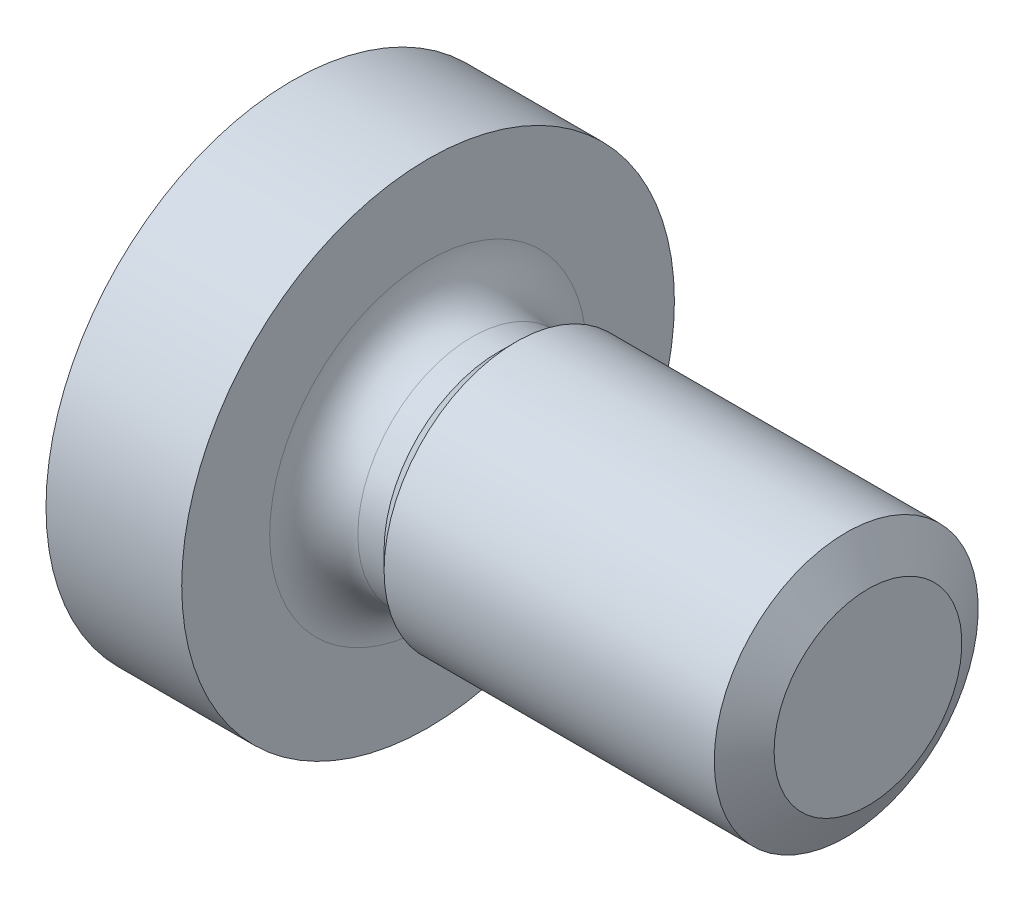
ISO-10303-21;
HEADER;
FILE_DESCRIPTION(('STEP AP214'),'2;1');
FILE_NAME('part.step','',(''),(''),'','','');
FILE_SCHEMA(('AUTOMOTIVE_DESIGN { 1 0 10303 214 1 1 1 1 }'));
ENDSEC;
DATA;
#1=APPLICATION_CONTEXT('core data for automotive mechanical design processes');
#2=APPLICATION_PROTOCOL_DEFINITION('international standard','automotive_design',2000,#1);
#3=PRODUCT_CONTEXT('',#1,'mechanical');
#4=PRODUCT('Part','Part','',(#3));
#5=PRODUCT_RELATED_PRODUCT_CATEGORY('part','',(#4));
#6=PRODUCT_DEFINITION_FORMATION('','',#4);
#7=PRODUCT_DEFINITION_CONTEXT('part definition',#1,'design');
#8=PRODUCT_DEFINITION('design','',#6,#7);
#9=PRODUCT_DEFINITION_SHAPE('','',#8);
#10=(LENGTH_UNIT() NAMED_UNIT(*) SI_UNIT(.MILLI.,.METRE.));
#11=(NAMED_UNIT(*) PLANE_ANGLE_UNIT() SI_UNIT($,.RADIAN.));
#12=(NAMED_UNIT(*) SI_UNIT($,.STERADIAN.) SOLID_ANGLE_UNIT());
#13=UNCERTAINTY_MEASURE_WITH_UNIT(LENGTH_MEASURE(1.E-05),#10,'distance_accuracy_value','');
#14=(GEOMETRIC_REPRESENTATION_CONTEXT(3) GLOBAL_UNCERTAINTY_ASSIGNED_CONTEXT((#13)) GLOBAL_UNIT_ASSIGNED_CONTEXT((#10,
#11,#12)) REPRESENTATION_CONTEXT('',''));
#15=CARTESIAN_POINT('',(0.,0.,0.));
#16=DIRECTION('',(0.,0.,1.));
#17=DIRECTION('',(1.,0.,0.));
#18=AXIS2_PLACEMENT_3D('',#15,#16,#17);
#19=CARTESIAN_POINT('',(1.8,0.,0.));
#20=DIRECTION('',(0.137568371274688,0.,-0.990492273177751));
#21=DIRECTION('',(-0.990492273177752,0.,-0.137568371274688));
#22=AXIS2_PLACEMENT_3D('',#19,#20,#21);
#23=PLANE('',#22);
#24=DIRECTION('',(-0.763885421064628,-0.636571184220523,-0.106095197370087));
#25=VECTOR('',#24,1.);
#26=CARTESIAN_POINT('',(1.8,0.,0.));
#27=LINE('',#26,#25);
#28=CARTESIAN_POINT('',(1.8,0.,0.));
#29=VERTEX_POINT('',#28);
#30=CARTESIAN_POINT('',(0.188839901093437,-1.34263341575547,-0.223772235959245));
#31=VERTEX_POINT('',#30);
#32=EDGE_CURVE('E159',#29,#31,#27,.T.);
#33=ORIENTED_EDGE('',*,*,#32,.F.);
#34=DIRECTION('',(-0.981250680241291,-0.136284816700179,-0.136284816700179));
#35=VECTOR('',#34,1.);
#36=CARTESIAN_POINT('',(1.8,0.,0.));
#37=LINE('',#36,#35);
#38=CARTESIAN_POINT('',(0.0123443765883179,-0.248285503251622,-0.248285503251623));
#39=VERTEX_POINT('',#38);
#40=EDGE_CURVE('E120',#29,#39,#37,.T.);
#41=ORIENTED_EDGE('',*,*,#40,.T.);
#42=CARTESIAN_POINT('',(4.93943981831946,0.,0.436033308099924));
#43=DIRECTION('',(0.137568371274688,0.,-0.990492273177751));
#44=DIRECTION('',(-0.990492273177752,0.,-0.137568371274688));
#45=AXIS2_PLACEMENT_3D('',#42,#43,#44);
#46=CIRCLE('',#45,4.98058304002877);
#47=EDGE_CURVE('E133',#31,#39,#46,.T.);
#48=ORIENTED_EDGE('',*,*,#47,.F.);
#49=EDGE_LOOP('',(#33,#41,#48));
#50=FACE_BOUND('',#49,.T.);
#51=ADVANCED_FACE('F40',(#50),#23,.F.);
#52=CARTESIAN_POINT('',(1.8,0.,0.));
#53=DIRECTION('',(0.137568371274688,0.,0.990492273177752));
#54=DIRECTION('',(0.990492273177752,0.,-0.137568371274688));
#55=AXIS2_PLACEMENT_3D('',#52,#53,#54);
#56=PLANE('',#55);
#57=CARTESIAN_POINT('',(4.93943981831946,0.,-0.436033308099924));
#58=DIRECTION('',(0.137568371274688,0.,0.990492273177752));
#59=DIRECTION('',(0.990492273177752,0.,-0.137568371274688));
#60=AXIS2_PLACEMENT_3D('',#57,#58,#59);
#61=CIRCLE('',#60,4.98058304002877);
#62=CARTESIAN_POINT('',(0.0123443765883179,-0.248285503251624,0.248285503251622));
#63=VERTEX_POINT('',#62);
#64=CARTESIAN_POINT('',(0.188839901093437,-1.34263341575547,0.223772235959245));
#65=VERTEX_POINT('',#64);
#66=EDGE_CURVE('E63',#63,#65,#61,.T.);
#67=ORIENTED_EDGE('',*,*,#66,.F.);
#68=DIRECTION('',(0.981250680241291,0.13628481670018,-0.136284816700179));
#69=VECTOR('',#68,1.);
#70=CARTESIAN_POINT('',(1.8,0.,0.));
#71=LINE('',#70,#69);
#72=EDGE_CURVE('E11',#63,#29,#71,.T.);
#73=ORIENTED_EDGE('',*,*,#72,.T.);
#74=DIRECTION('',(-0.763885421064628,-0.636571184220523,0.106095197370087));
#75=VECTOR('',#74,1.);
#76=CARTESIAN_POINT('',(1.8,0.,0.));
#77=LINE('',#76,#75);
#78=EDGE_CURVE('E160',#29,#65,#77,.T.);
#79=ORIENTED_EDGE('',*,*,#78,.T.);
#80=EDGE_LOOP('',(#67,#73,#79));
#81=FACE_BOUND('',#80,.T.);
#82=ADVANCED_FACE('F175',(#81),#56,.F.);
#83=CARTESIAN_POINT('',(-1.33175770411172,0.,0.));
#84=DIRECTION('',(-1.,0.,0.));
#85=DIRECTION('',(0.,0.,1.));
#86=AXIS2_PLACEMENT_3D('',#83,#84,#85);
#87=CYLINDRICAL_SURFACE('',#86,1.5);
#88=CARTESIAN_POINT('',(3.4,0.,0.));
#89=DIRECTION('',(-1.,0.,0.));
#90=DIRECTION('',(0.,0.,1.));
#91=AXIS2_PLACEMENT_3D('',#88,#89,#90);
#92=CIRCLE('',#91,1.5);
#93=CARTESIAN_POINT('',(3.4,0.,1.5));
#94=VERTEX_POINT('',#93);
#95=EDGE_CURVE('E196',#94,#94,#92,.T.);
#96=ORIENTED_EDGE('',*,*,#95,.F.);
#97=EDGE_LOOP('',(#96));
#98=FACE_BOUND('',#97,.T.);
#99=CARTESIAN_POINT('',(7.15270800287213,0.,0.));
#100=DIRECTION('',(-1.,0.,0.));
#101=DIRECTION('',(0.,0.,1.));
#102=AXIS2_PLACEMENT_3D('',#99,#100,#101);
#103=CIRCLE('',#102,1.5);
#104=CARTESIAN_POINT('',(7.15270800287213,0.,1.5));
#105=VERTEX_POINT('',#104);
#106=EDGE_CURVE('E193',#105,#105,#103,.T.);
#107=ORIENTED_EDGE('',*,*,#106,.T.);
#108=EDGE_LOOP('',(#107));
#109=FACE_BOUND('',#108,.T.);
#110=ADVANCED_FACE('F240',(#98,#109),#87,.T.);
#111=CARTESIAN_POINT('',(5.,0.,0.));
#112=DIRECTION('',(-1.,0.,0.));
#113=DIRECTION('',(0.,1.,0.));
#114=AXIS2_PLACEMENT_3D('',#111,#112,#113);
#115=SPHERICAL_SURFACE('',#114,5.);
#116=CARTESIAN_POINT('',(3.68852459016393,0.,-1.57377049180328));
#117=DIRECTION('',(0.64018439966448,0.,0.768221279597376));
#118=DIRECTION('',(0.768221279597376,0.,-0.64018439966448));
#119=AXIS2_PLACEMENT_3D('',#116,#117,#118);
#120=CIRCLE('',#119,4.56106113624062);
#121=CARTESIAN_POINT('',(0.188839901093437,0.22377223595924,1.34263341575547));
#122=VERTEX_POINT('',#121);
#123=CARTESIAN_POINT('',(0.188839901093437,-0.22377223595925,1.34263341575547));
#124=VERTEX_POINT('',#123);
#125=EDGE_CURVE('E126',#122,#124,#120,.T.);
#126=ORIENTED_EDGE('',*,*,#125,.T.);
#127=CARTESIAN_POINT('',(4.93943981831946,0.436033308099924,0.));
#128=DIRECTION('',(0.137568371274688,-0.990492273177751,0.));
#129=DIRECTION('',(0.990492273177752,0.137568371274688,0.));
#130=AXIS2_PLACEMENT_3D('',#127,#128,#129);
#131=CIRCLE('',#130,4.98058304002877);
#132=EDGE_CURVE('E142',#124,#63,#131,.T.);
#133=ORIENTED_EDGE('',*,*,#132,.T.);
#134=ORIENTED_EDGE('',*,*,#66,.T.);
#135=CARTESIAN_POINT('',(3.68852459016393,1.57377049180328,0.));
#136=DIRECTION('',(0.64018439966448,-0.768221279597376,0.));
#137=DIRECTION('',(0.768221279597376,0.64018439966448,0.));
#138=AXIS2_PLACEMENT_3D('',#135,#136,#137);
#139=CIRCLE('',#138,4.56106113624062);
#140=EDGE_CURVE('E172',#65,#31,#139,.T.);
#141=ORIENTED_EDGE('',*,*,#140,.T.);
#142=ORIENTED_EDGE('',*,*,#47,.T.);
#143=CARTESIAN_POINT('',(0.188839901093437,-0.22377223595924,-1.34263341575547));
#144=VERTEX_POINT('',#143);
#145=EDGE_CURVE('E122',#39,#144,#131,.T.);
#146=ORIENTED_EDGE('',*,*,#145,.T.);
#147=CARTESIAN_POINT('',(3.68852459016393,0.,1.57377049180328));
#148=DIRECTION('',(0.64018439966448,0.,-0.768221279597376));
#149=DIRECTION('',(-0.768221279597376,0.,-0.64018439966448));
#150=AXIS2_PLACEMENT_3D('',#147,#148,#149);
#151=CIRCLE('',#150,4.56106113624062);
#152=CARTESIAN_POINT('',(0.188839901093437,0.223772235959249,-1.34263341575547));
#153=VERTEX_POINT('',#152);
#154=EDGE_CURVE('E114',#144,#153,#151,.T.);
#155=ORIENTED_EDGE('',*,*,#154,.T.);
#156=CARTESIAN_POINT('',(4.93943981831946,-0.436033308099924,0.));
#157=DIRECTION('',(0.137568371274688,0.990492273177752,0.));
#158=DIRECTION('',(-0.990492273177752,0.137568371274688,0.));
#159=AXIS2_PLACEMENT_3D('',#156,#157,#158);
#160=CIRCLE('',#159,4.98058304002877);
#161=CARTESIAN_POINT('',(0.0123443765883179,0.248285503251624,-0.248285503251623));
#162=VERTEX_POINT('',#161);
#163=EDGE_CURVE('E105',#153,#162,#160,.T.);
#164=ORIENTED_EDGE('',*,*,#163,.T.);
#165=CARTESIAN_POINT('',(0.188839901093437,1.34263341575547,-0.223772235959245));
#166=VERTEX_POINT('',#165);
#167=EDGE_CURVE('E150',#162,#166,#46,.T.);
#168=ORIENTED_EDGE('',*,*,#167,.T.);
#169=CARTESIAN_POINT('',(3.68852459016393,-1.57377049180328,0.));
#170=DIRECTION('',(0.64018439966448,0.768221279597376,0.));
#171=DIRECTION('',(-0.768221279597376,0.64018439966448,0.));
#172=AXIS2_PLACEMENT_3D('',#169,#170,#171);
#173=CIRCLE('',#172,4.56106113624062);
#174=CARTESIAN_POINT('',(0.188839901093437,1.34263341575547,0.223772235959245));
#175=VERTEX_POINT('',#174);
#176=EDGE_CURVE('E163',#166,#175,#173,.T.);
#177=ORIENTED_EDGE('',*,*,#176,.T.);
#178=CARTESIAN_POINT('',(0.0123443765883179,0.248285503251622,0.248285503251622));
#179=VERTEX_POINT('',#178);
#180=EDGE_CURVE('E155',#175,#179,#61,.T.);
#181=ORIENTED_EDGE('',*,*,#180,.T.);
#182=EDGE_CURVE('E55',#179,#122,#160,.T.);
#183=ORIENTED_EDGE('',*,*,#182,.T.);
#184=EDGE_LOOP('',(#126,#133,#134,#141,#142,#146,#155,#164,#168,#177,#181,#183));
#185=FACE_BOUND('',#184,.T.);
#186=CARTESIAN_POINT('',(0.857536964558404,0.,0.));
#187=DIRECTION('',(-1.,0.,0.));
#188=DIRECTION('',(0.,0.,1.));
#189=AXIS2_PLACEMENT_3D('',#186,#187,#188);
#190=CIRCLE('',#189,2.8);
#191=CARTESIAN_POINT('',(0.857536964558404,0.,2.8));
#192=VERTEX_POINT('',#191);
#193=EDGE_CURVE('E176',#192,#192,#190,.T.);
#194=ORIENTED_EDGE('',*,*,#193,.T.);
#195=EDGE_LOOP('',(#194));
#196=FACE_BOUND('',#195,.T.);
#197=ADVANCED_FACE('F42',(#185,#196),#115,.T.);
#198=CARTESIAN_POINT('',(-1.33175770411172,0.,0.));
#199=DIRECTION('',(-1.,0.,0.));
#200=DIRECTION('',(0.,0.,1.));
#201=AXIS2_PLACEMENT_3D('',#198,#199,#200);
#202=CYLINDRICAL_SURFACE('',#201,2.8);
#203=ORIENTED_EDGE('',*,*,#193,.F.);
#204=EDGE_LOOP('',(#203));
#205=FACE_BOUND('',#204,.T.);
#206=CARTESIAN_POINT('',(2.4,0.,0.));
#207=DIRECTION('',(-1.,0.,0.));
#208=DIRECTION('',(0.,0.,1.));
#209=AXIS2_PLACEMENT_3D('',#206,#207,#208);
#210=CIRCLE('',#209,2.8);
#211=CARTESIAN_POINT('',(2.4,0.,2.8));
#212=VERTEX_POINT('',#211);
#213=EDGE_CURVE('E179',#212,#212,#210,.T.);
#214=ORIENTED_EDGE('',*,*,#213,.T.);
#215=EDGE_LOOP('',(#214));
#216=FACE_BOUND('',#215,.T.);
#217=ADVANCED_FACE('F213',(#205,#216),#202,.T.);
#218=CARTESIAN_POINT('',(2.4,1.8,0.));
#219=DIRECTION('',(-1.,0.,0.));
#220=DIRECTION('',(0.,0.,1.));
#221=AXIS2_PLACEMENT_3D('',#218,#219,#220);
#222=PLANE('',#221);
#223=ORIENTED_EDGE('',*,*,#213,.F.);
#224=EDGE_LOOP('',(#223));
#225=FACE_BOUND('',#224,.T.);
#226=CARTESIAN_POINT('',(2.4,0.,0.));
#227=DIRECTION('',(-1.,0.,0.));
#228=DIRECTION('',(0.,0.,1.));
#229=AXIS2_PLACEMENT_3D('',#226,#227,#228);
#230=CIRCLE('',#229,1.8);
#231=CARTESIAN_POINT('',(2.4,0.,1.8));
#232=VERTEX_POINT('',#231);
#233=EDGE_CURVE('E205',#232,#232,#230,.T.);
#234=ORIENTED_EDGE('',*,*,#233,.T.);
#235=EDGE_LOOP('',(#234));
#236=FACE_BOUND('',#235,.T.);
#237=ADVANCED_FACE('F215',(#225,#236),#222,.F.);
#238=CARTESIAN_POINT('',(2.901,0.,0.));
#239=DIRECTION('',(-1.,0.,0.));
#240=DIRECTION('',(0.,0.,1.));
#241=AXIS2_PLACEMENT_3D('',#238,#239,#240);
#242=TOROIDAL_SURFACE('',#241,1.8,0.501);
#243=ORIENTED_EDGE('',*,*,#233,.F.);
#244=EDGE_LOOP('',(#243));
#245=FACE_BOUND('',#244,.T.);
#246=CARTESIAN_POINT('',(2.901,0.,0.));
#247=DIRECTION('',(-1.,0.,0.));
#248=DIRECTION('',(0.,0.,1.));
#249=AXIS2_PLACEMENT_3D('',#246,#247,#248);
#250=CIRCLE('',#249,1.299);
#251=CARTESIAN_POINT('',(2.901,0.,1.299));
#252=VERTEX_POINT('',#251);
#253=EDGE_CURVE('E202',#252,#252,#250,.T.);
#254=ORIENTED_EDGE('',*,*,#253,.T.);
#255=EDGE_LOOP('',(#254));
#256=FACE_BOUND('',#255,.T.);
#257=ADVANCED_FACE('F218',(#245,#256),#242,.F.);
#258=CARTESIAN_POINT('',(-1.33175770411172,0.,0.));
#259=DIRECTION('',(-1.,0.,0.));
#260=DIRECTION('',(0.,0.,1.));
#261=AXIS2_PLACEMENT_3D('',#258,#259,#260);
#262=CYLINDRICAL_SURFACE('',#261,1.299);
#263=ORIENTED_EDGE('',*,*,#253,.F.);
#264=EDGE_LOOP('',(#263));
#265=FACE_BOUND('',#264,.T.);
#266=CARTESIAN_POINT('',(3.199,0.,0.));
#267=DIRECTION('',(-1.,0.,0.));
#268=DIRECTION('',(0.,0.,1.));
#269=AXIS2_PLACEMENT_3D('',#266,#267,#268);
#270=CIRCLE('',#269,1.299);
#271=CARTESIAN_POINT('',(3.199,0.,1.299));
#272=VERTEX_POINT('',#271);
#273=EDGE_CURVE('E199',#272,#272,#270,.T.);
#274=ORIENTED_EDGE('',*,*,#273,.T.);
#275=EDGE_LOOP('',(#274));
#276=FACE_BOUND('',#275,.T.);
#277=ADVANCED_FACE('F224',(#265,#276),#262,.T.);
#278=CARTESIAN_POINT('',(3.4,0.,0.));
#279=DIRECTION('',(1.,0.,0.));
#280=DIRECTION('',(0.,0.,-1.));
#281=AXIS2_PLACEMENT_3D('',#278,#279,#280);
#282=CONICAL_SURFACE('',#281,1.5,0.785398163397443);
#283=ORIENTED_EDGE('',*,*,#273,.F.);
#284=EDGE_LOOP('',(#283));
#285=FACE_BOUND('',#284,.T.);
#286=ORIENTED_EDGE('',*,*,#95,.T.);
#287=EDGE_LOOP('',(#286));
#288=FACE_BOUND('',#287,.T.);
#289=ADVANCED_FACE('F230',(#285,#288),#282,.T.);
#290=CARTESIAN_POINT('',(7.15270800287213,0.,0.));
#291=DIRECTION('',(-1.,0.,0.));
#292=DIRECTION('',(0.,0.,1.));
#293=AXIS2_PLACEMENT_3D('',#290,#291,#292);
#294=CONICAL_SURFACE('',#293,1.5,1.0518880185529);
#295=CARTESIAN_POINT('',(7.4,0.,0.));
#296=DIRECTION('',(-1.,0.,0.));
#297=DIRECTION('',(0.,0.,1.));
#298=AXIS2_PLACEMENT_3D('',#295,#296,#297);
#299=CIRCLE('',#298,1.067);
#300=CARTESIAN_POINT('',(7.4,0.,1.067));
#301=VERTEX_POINT('',#300);
#302=EDGE_CURVE('E164',#301,#301,#299,.T.);
#303=ORIENTED_EDGE('',*,*,#302,.T.);
#304=EDGE_LOOP('',(#303));
#305=FACE_BOUND('',#304,.T.);
#306=ORIENTED_EDGE('',*,*,#106,.F.);
#307=EDGE_LOOP('',(#306));
#308=FACE_BOUND('',#307,.T.);
#309=ADVANCED_FACE('F236',(#305,#308),#294,.T.);
#310=CARTESIAN_POINT('',(7.4,0.,0.));
#311=DIRECTION('',(-1.,0.,0.));
#312=DIRECTION('',(0.,0.,1.));
#313=AXIS2_PLACEMENT_3D('',#310,#311,#312);
#314=PLANE('',#313);
#315=ORIENTED_EDGE('',*,*,#302,.F.);
#316=EDGE_LOOP('',(#315));
#317=FACE_BOUND('',#316,.T.);
#318=ADVANCED_FACE('F247',(#317),#314,.F.);
#319=ORIENTED_EDGE('',*,*,#167,.F.);
#320=DIRECTION('',(0.981250680241291,-0.13628481670018,0.136284816700179));
#321=VECTOR('',#320,1.);
#322=CARTESIAN_POINT('',(1.8,0.,0.));
#323=LINE('',#322,#321);
#324=EDGE_CURVE('E103',#162,#29,#323,.T.);
#325=ORIENTED_EDGE('',*,*,#324,.T.);
#326=DIRECTION('',(-0.763885421064628,0.636571184220523,-0.106095197370087));
#327=VECTOR('',#326,1.);
#328=CARTESIAN_POINT('',(1.8,0.,0.));
#329=LINE('',#328,#327);
#330=EDGE_CURVE('E149',#29,#166,#329,.T.);
#331=ORIENTED_EDGE('',*,*,#330,.T.);
#332=EDGE_LOOP('',(#319,#325,#331));
#333=FACE_BOUND('',#332,.T.);
#334=ADVANCED_FACE('F147',(#333),#23,.F.);
#335=CARTESIAN_POINT('',(0.,1.5,-0.25));
#336=DIRECTION('',(0.64018439966448,0.768221279597376,0.));
#337=DIRECTION('',(-0.768221279597376,0.64018439966448,0.));
#338=AXIS2_PLACEMENT_3D('',#335,#336,#337);
#339=PLANE('',#338);
#340=ORIENTED_EDGE('',*,*,#330,.F.);
#341=DIRECTION('',(-0.763885421064628,0.636571184220523,0.106095197370087));
#342=VECTOR('',#341,1.);
#343=CARTESIAN_POINT('',(1.8,0.,0.));
#344=LINE('',#343,#342);
#345=EDGE_CURVE('E153',#29,#175,#344,.T.);
#346=ORIENTED_EDGE('',*,*,#345,.T.);
#347=ORIENTED_EDGE('',*,*,#176,.F.);
#348=EDGE_LOOP('',(#340,#346,#347));
#349=FACE_BOUND('',#348,.T.);
#350=ADVANCED_FACE('F162',(#349),#339,.F.);
#351=CARTESIAN_POINT('',(0.,-1.5,0.25));
#352=DIRECTION('',(0.64018439966448,-0.768221279597376,0.));
#353=DIRECTION('',(0.768221279597376,0.64018439966448,0.));
#354=AXIS2_PLACEMENT_3D('',#351,#352,#353);
#355=PLANE('',#354);
#356=ORIENTED_EDGE('',*,*,#78,.F.);
#357=ORIENTED_EDGE('',*,*,#32,.T.);
#358=ORIENTED_EDGE('',*,*,#140,.F.);
#359=EDGE_LOOP('',(#356,#357,#358));
#360=FACE_BOUND('',#359,.T.);
#361=ADVANCED_FACE('F171',(#360),#355,.F.);
#362=ORIENTED_EDGE('',*,*,#345,.F.);
#363=DIRECTION('',(-0.981250680241291,0.136284816700179,0.136284816700179));
#364=VECTOR('',#363,1.);
#365=CARTESIAN_POINT('',(1.8,0.,0.));
#366=LINE('',#365,#364);
#367=EDGE_CURVE('E48',#29,#179,#366,.T.);
#368=ORIENTED_EDGE('',*,*,#367,.T.);
#369=ORIENTED_EDGE('',*,*,#180,.F.);
#370=EDGE_LOOP('',(#362,#368,#369));
#371=FACE_BOUND('',#370,.T.);
#372=ADVANCED_FACE('F154',(#371),#56,.F.);
#373=CARTESIAN_POINT('',(1.8,0.,0.));
#374=DIRECTION('',(0.137568371274688,-0.990492273177751,0.));
#375=DIRECTION('',(-0.990492273177752,-0.137568371274688,0.));
#376=AXIS2_PLACEMENT_3D('',#373,#374,#375);
#377=PLANE('',#376);
#378=DIRECTION('',(-0.763885421064628,-0.106095197370089,0.636571184220523));
#379=VECTOR('',#378,1.);
#380=CARTESIAN_POINT('',(1.8,0.,0.));
#381=LINE('',#380,#379);
#382=EDGE_CURVE('E117',#29,#124,#381,.T.);
#383=ORIENTED_EDGE('',*,*,#382,.F.);
#384=ORIENTED_EDGE('',*,*,#72,.F.);
#385=ORIENTED_EDGE('',*,*,#132,.F.);
#386=EDGE_LOOP('',(#383,#384,#385));
#387=FACE_BOUND('',#386,.T.);
#388=ADVANCED_FACE('F141',(#387),#377,.F.);
#389=CARTESIAN_POINT('',(1.8,0.,0.));
#390=DIRECTION('',(0.137568371274688,0.990492273177752,0.));
#391=DIRECTION('',(0.990492273177752,-0.137568371274688,0.));
#392=AXIS2_PLACEMENT_3D('',#389,#390,#391);
#393=PLANE('',#392);
#394=ORIENTED_EDGE('',*,*,#367,.F.);
#395=DIRECTION('',(-0.763885421064628,0.106095197370085,0.636571184220523));
#396=VECTOR('',#395,1.);
#397=CARTESIAN_POINT('',(1.8,0.,0.));
#398=LINE('',#397,#396);
#399=EDGE_CURVE('E108',#29,#122,#398,.T.);
#400=ORIENTED_EDGE('',*,*,#399,.T.);
#401=ORIENTED_EDGE('',*,*,#182,.F.);
#402=EDGE_LOOP('',(#394,#400,#401));
#403=FACE_BOUND('',#402,.T.);
#404=ADVANCED_FACE('F129',(#403),#393,.F.);
#405=CARTESIAN_POINT('',(0.,-0.250000000000005,1.5));
#406=DIRECTION('',(0.64018439966448,0.,0.768221279597376));
#407=DIRECTION('',(-0.768221279597376,0.,0.64018439966448));
#408=AXIS2_PLACEMENT_3D('',#405,#406,#407);
#409=PLANE('',#408);
#410=ORIENTED_EDGE('',*,*,#399,.F.);
#411=ORIENTED_EDGE('',*,*,#382,.T.);
#412=ORIENTED_EDGE('',*,*,#125,.F.);
#413=EDGE_LOOP('',(#410,#411,#412));
#414=FACE_BOUND('',#413,.T.);
#415=ADVANCED_FACE('F137',(#414),#409,.F.);
#416=ORIENTED_EDGE('',*,*,#40,.F.);
#417=DIRECTION('',(-0.763885421064628,-0.106095197370085,-0.636571184220523));
#418=VECTOR('',#417,1.);
#419=CARTESIAN_POINT('',(1.8,0.,0.));
#420=LINE('',#419,#418);
#421=EDGE_CURVE('E111',#29,#144,#420,.T.);
#422=ORIENTED_EDGE('',*,*,#421,.T.);
#423=ORIENTED_EDGE('',*,*,#145,.F.);
#424=EDGE_LOOP('',(#416,#422,#423));
#425=FACE_BOUND('',#424,.T.);
#426=ADVANCED_FACE('F121',(#425),#377,.F.);
#427=CARTESIAN_POINT('',(0.,0.250000000000005,-1.5));
#428=DIRECTION('',(0.64018439966448,0.,-0.768221279597376));
#429=DIRECTION('',(0.768221279597376,0.,0.64018439966448));
#430=AXIS2_PLACEMENT_3D('',#427,#428,#429);
#431=PLANE('',#430);
#432=ORIENTED_EDGE('',*,*,#421,.F.);
#433=DIRECTION('',(-0.763885421064628,0.106095197370089,-0.636571184220523));
#434=VECTOR('',#433,1.);
#435=CARTESIAN_POINT('',(1.8,0.,0.));
#436=LINE('',#435,#434);
#437=EDGE_CURVE('E99',#29,#153,#436,.T.);
#438=ORIENTED_EDGE('',*,*,#437,.T.);
#439=ORIENTED_EDGE('',*,*,#154,.F.);
#440=EDGE_LOOP('',(#432,#438,#439));
#441=FACE_BOUND('',#440,.T.);
#442=ADVANCED_FACE('F113',(#441),#431,.F.);
#443=ORIENTED_EDGE('',*,*,#437,.F.);
#444=ORIENTED_EDGE('',*,*,#324,.F.);
#445=ORIENTED_EDGE('',*,*,#163,.F.);
#446=EDGE_LOOP('',(#443,#444,#445));
#447=FACE_BOUND('',#446,.T.);
#448=ADVANCED_FACE('F101',(#447),#393,.F.);
#449=CLOSED_SHELL('',(#51,#82,#110,#197,#217,#237,#257,#277,#289,#309,#318,#334,#350,#361,#372,
#388,#404,#415,#426,#442,#448));
#450=MANIFOLD_SOLID_BREP('B2',#449);
#451=ADVANCED_BREP_SHAPE_REPRESENTATION('',(#18,#450),#14);
#452=SHAPE_DEFINITION_REPRESENTATION(#9,#451);
ENDSEC;
END-ISO-10303-21;
